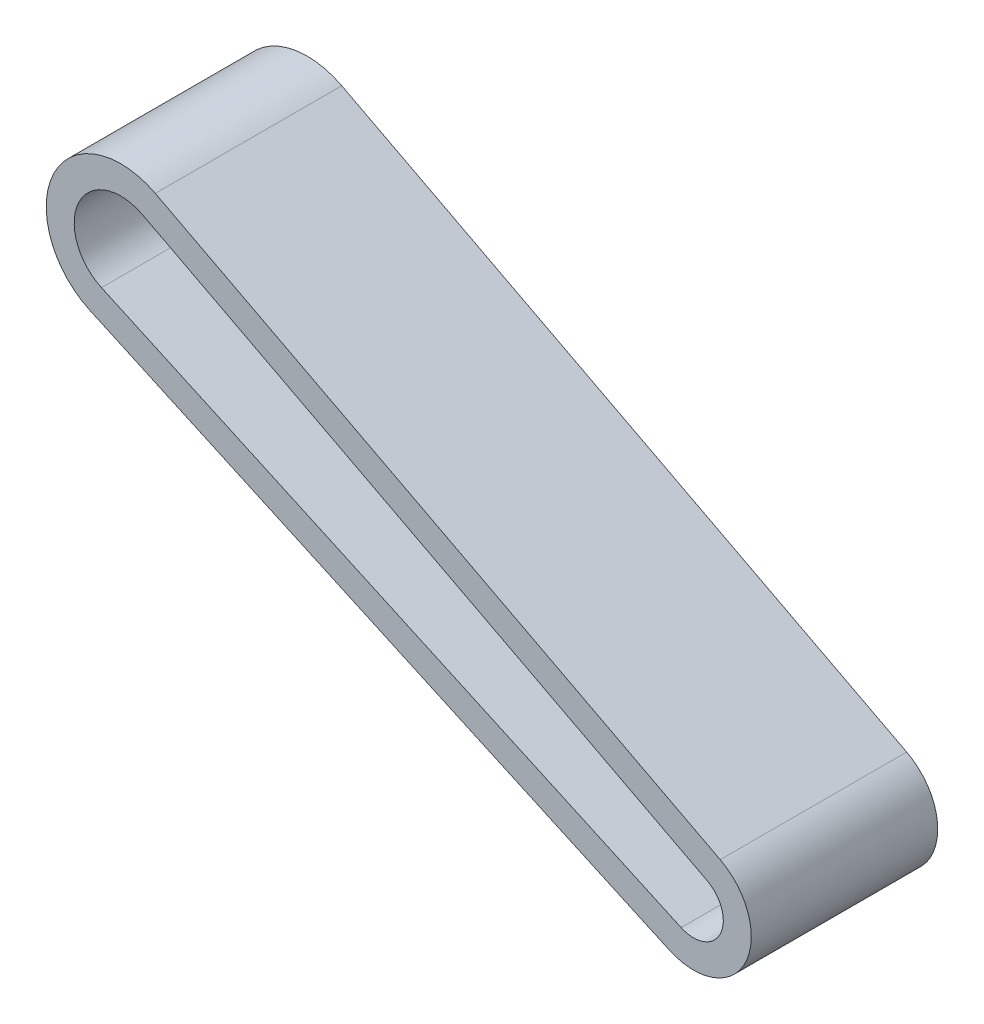
ISO-10303-21;
HEADER;
FILE_DESCRIPTION(('STEP AP214'),'2;1');
FILE_NAME('part.step','',(''),(''),'','','');
FILE_SCHEMA(('AUTOMOTIVE_DESIGN { 1 0 10303 214 1 1 1 1 }'));
ENDSEC;
DATA;
#1=APPLICATION_CONTEXT('core data for automotive mechanical design processes');
#2=APPLICATION_PROTOCOL_DEFINITION('international standard','automotive_design',2000,#1);
#3=PRODUCT_CONTEXT('',#1,'mechanical');
#4=PRODUCT('Part','Part','',(#3));
#5=PRODUCT_RELATED_PRODUCT_CATEGORY('part','',(#4));
#6=PRODUCT_DEFINITION_FORMATION('','',#4);
#7=PRODUCT_DEFINITION_CONTEXT('part definition',#1,'design');
#8=PRODUCT_DEFINITION('design','',#6,#7);
#9=PRODUCT_DEFINITION_SHAPE('','',#8);
#10=(LENGTH_UNIT() NAMED_UNIT(*) SI_UNIT(.MILLI.,.METRE.));
#11=(NAMED_UNIT(*) PLANE_ANGLE_UNIT() SI_UNIT($,.RADIAN.));
#12=(NAMED_UNIT(*) SI_UNIT($,.STERADIAN.) SOLID_ANGLE_UNIT());
#13=UNCERTAINTY_MEASURE_WITH_UNIT(LENGTH_MEASURE(1.E-05),#10,'distance_accuracy_value','');
#14=(GEOMETRIC_REPRESENTATION_CONTEXT(3) GLOBAL_UNCERTAINTY_ASSIGNED_CONTEXT((#13)) GLOBAL_UNIT_ASSIGNED_CONTEXT((#10,
#11,#12)) REPRESENTATION_CONTEXT('',''));
#15=CARTESIAN_POINT('',(0.,0.,0.));
#16=DIRECTION('',(0.,0.,1.));
#17=DIRECTION('',(1.,0.,0.));
#18=AXIS2_PLACEMENT_3D('',#15,#16,#17);
#19=CARTESIAN_POINT('',(383.646560531932,7.49999999999694,5.));
#20=DIRECTION('',(0.,0.,1.));
#21=DIRECTION('',(1.,0.,0.));
#22=AXIS2_PLACEMENT_3D('',#19,#20,#21);
#23=PLANE('',#22);
#24=CARTESIAN_POINT('',(383.646560531932,7.49999999999694,5.));
#25=DIRECTION('',(0.,0.,1.));
#26=DIRECTION('',(1.,0.,0.));
#27=AXIS2_PLACEMENT_3D('',#24,#25,#26);
#28=CIRCLE('',#27,3.10000000000006);
#29=CARTESIAN_POINT('',(382.360077523528,4.67954587537645,5.));
#30=VERTEX_POINT('',#29);
#31=CARTESIAN_POINT('',(385.079723977688,10.2488256652127,5.));
#32=VERTEX_POINT('',#31);
#33=EDGE_CURVE('E162',#30,#32,#28,.T.);
#34=ORIENTED_EDGE('',*,*,#33,.T.);
#35=DIRECTION('',(-0.886717956521201,0.462310788953562,0.));
#36=VECTOR('',#35,1.);
#37=CARTESIAN_POINT('',(385.079723977688,10.2488256652127,5.));
#38=LINE('',#37,#36);
#39=CARTESIAN_POINT('',(354.778871080645,26.0468718260864,5.));
#40=VERTEX_POINT('',#39);
#41=EDGE_CURVE('E165',#32,#40,#38,.T.);
#42=ORIENTED_EDGE('',*,*,#41,.T.);
#43=CARTESIAN_POINT('',(352.929627924831,22.5000000000016,5.));
#44=DIRECTION('',(0.,0.,1.));
#45=DIRECTION('',(1.,0.,0.));
#46=AXIS2_PLACEMENT_3D('',#43,#44,#45);
#47=CIRCLE('',#46,4.);
#48=CARTESIAN_POINT('',(351.269649849471,18.8607043553301,5.));
#49=VERTEX_POINT('',#48);
#50=EDGE_CURVE('E168',#40,#49,#47,.T.);
#51=ORIENTED_EDGE('',*,*,#50,.T.);
#52=DIRECTION('',(0.909823911167876,-0.414994518839935,0.));
#53=VECTOR('',#52,1.);
#54=CARTESIAN_POINT('',(351.269649849471,18.8607043553301,5.));
#55=LINE('',#54,#53);
#56=EDGE_CURVE('E170',#49,#30,#55,.T.);
#57=ORIENTED_EDGE('',*,*,#56,.T.);
#58=EDGE_LOOP('',(#34,#42,#51,#57));
#59=FACE_BOUND('',#58,.T.);
#60=DIRECTION('',(-0.886717956521201,0.462310788953562,0.));
#61=VECTOR('',#60,1.);
#62=CARTESIAN_POINT('',(384.386257794257,8.91874873043091,5.));
#63=LINE('',#62,#61);
#64=CARTESIAN_POINT('',(384.386257794257,8.91874873043091,5.));
#65=VERTEX_POINT('',#64);
#66=CARTESIAN_POINT('',(354.085404897215,24.7167948913046,5.));
#67=VERTEX_POINT('',#66);
#68=EDGE_CURVE('E134',#65,#67,#63,.T.);
#69=ORIENTED_EDGE('',*,*,#68,.F.);
#70=CARTESIAN_POINT('',(383.646560531932,7.49999999999694,5.));
#71=DIRECTION('',(0.,0.,1.));
#72=DIRECTION('',(1.,0.,0.));
#73=AXIS2_PLACEMENT_3D('',#70,#71,#72);
#74=CIRCLE('',#73,1.60000000000006);
#75=CARTESIAN_POINT('',(382.982569301788,6.04428174212827,5.));
#76=VERTEX_POINT('',#75);
#77=EDGE_CURVE('E126',#76,#65,#74,.T.);
#78=ORIENTED_EDGE('',*,*,#77,.F.);
#79=DIRECTION('',(0.909823911167876,-0.414994518839935,0.));
#80=VECTOR('',#79,1.);
#81=CARTESIAN_POINT('',(351.892141627731,20.2254402220819,5.));
#82=LINE('',#81,#80);
#83=CARTESIAN_POINT('',(351.892141627731,20.2254402220819,5.));
#84=VERTEX_POINT('',#83);
#85=EDGE_CURVE('E148',#84,#76,#82,.T.);
#86=ORIENTED_EDGE('',*,*,#85,.F.);
#87=CARTESIAN_POINT('',(352.929627924831,22.5000000000016,5.));
#88=DIRECTION('',(0.,0.,1.));
#89=DIRECTION('',(1.,0.,0.));
#90=AXIS2_PLACEMENT_3D('',#87,#88,#89);
#91=CIRCLE('',#90,2.5);
#92=EDGE_CURVE('E146',#67,#84,#91,.T.);
#93=ORIENTED_EDGE('',*,*,#92,.F.);
#94=EDGE_LOOP('',(#69,#78,#86,#93));
#95=FACE_BOUND('',#94,.T.);
#96=ADVANCED_FACE('F61',(#59,#95),#23,.T.);
#97=CARTESIAN_POINT('',(383.646560531932,7.49999999999694,-5.));
#98=DIRECTION('',(0.,0.,1.));
#99=DIRECTION('',(1.,0.,0.));
#100=AXIS2_PLACEMENT_3D('',#97,#98,#99);
#101=PLANE('',#100);
#102=CARTESIAN_POINT('',(383.646560531932,7.49999999999694,-5.));
#103=DIRECTION('',(0.,0.,1.));
#104=DIRECTION('',(1.,0.,0.));
#105=AXIS2_PLACEMENT_3D('',#102,#103,#104);
#106=CIRCLE('',#105,3.10000000000006);
#107=CARTESIAN_POINT('',(382.360077523528,4.67954587537645,-5.));
#108=VERTEX_POINT('',#107);
#109=CARTESIAN_POINT('',(385.079723977688,10.2488256652127,-5.));
#110=VERTEX_POINT('',#109);
#111=EDGE_CURVE('E142',#108,#110,#106,.T.);
#112=ORIENTED_EDGE('',*,*,#111,.F.);
#113=DIRECTION('',(0.909823911167876,-0.414994518839935,0.));
#114=VECTOR('',#113,1.);
#115=CARTESIAN_POINT('',(351.269649849471,18.8607043553301,-5.));
#116=LINE('',#115,#114);
#117=CARTESIAN_POINT('',(351.269649849471,18.8607043553301,-5.));
#118=VERTEX_POINT('',#117);
#119=EDGE_CURVE('E166',#118,#108,#116,.T.);
#120=ORIENTED_EDGE('',*,*,#119,.F.);
#121=CARTESIAN_POINT('',(352.929627924831,22.5000000000016,-5.));
#122=DIRECTION('',(0.,0.,1.));
#123=DIRECTION('',(1.,0.,0.));
#124=AXIS2_PLACEMENT_3D('',#121,#122,#123);
#125=CIRCLE('',#124,4.);
#126=CARTESIAN_POINT('',(354.778871080645,26.0468718260864,-5.));
#127=VERTEX_POINT('',#126);
#128=EDGE_CURVE('E177',#127,#118,#125,.T.);
#129=ORIENTED_EDGE('',*,*,#128,.F.);
#130=DIRECTION('',(-0.886717956521201,0.462310788953562,0.));
#131=VECTOR('',#130,1.);
#132=CARTESIAN_POINT('',(385.079723977688,10.2488256652127,-5.));
#133=LINE('',#132,#131);
#134=EDGE_CURVE('E175',#110,#127,#133,.T.);
#135=ORIENTED_EDGE('',*,*,#134,.F.);
#136=EDGE_LOOP('',(#112,#120,#129,#135));
#137=FACE_BOUND('',#136,.T.);
#138=CARTESIAN_POINT('',(383.646560531932,7.49999999999694,-5.));
#139=DIRECTION('',(0.,0.,1.));
#140=DIRECTION('',(1.,0.,0.));
#141=AXIS2_PLACEMENT_3D('',#138,#139,#140);
#142=CIRCLE('',#141,1.60000000000006);
#143=CARTESIAN_POINT('',(382.982569301788,6.04428174212828,-5.));
#144=VERTEX_POINT('',#143);
#145=CARTESIAN_POINT('',(384.386257794257,8.91874873043091,-5.));
#146=VERTEX_POINT('',#145);
#147=EDGE_CURVE('E84',#144,#146,#142,.T.);
#148=ORIENTED_EDGE('',*,*,#147,.T.);
#149=DIRECTION('',(-0.886717956521201,0.462310788953562,0.));
#150=VECTOR('',#149,1.);
#151=CARTESIAN_POINT('',(384.386257794257,8.91874873043091,-5.));
#152=LINE('',#151,#150);
#153=CARTESIAN_POINT('',(354.085404897215,24.7167948913046,-5.));
#154=VERTEX_POINT('',#153);
#155=EDGE_CURVE('E141',#146,#154,#152,.T.);
#156=ORIENTED_EDGE('',*,*,#155,.T.);
#157=CARTESIAN_POINT('',(352.929627924831,22.5000000000016,-5.));
#158=DIRECTION('',(0.,0.,1.));
#159=DIRECTION('',(1.,0.,0.));
#160=AXIS2_PLACEMENT_3D('',#157,#158,#159);
#161=CIRCLE('',#160,2.5);
#162=CARTESIAN_POINT('',(351.892141627731,20.2254402220819,-5.));
#163=VERTEX_POINT('',#162);
#164=EDGE_CURVE('E154',#154,#163,#161,.T.);
#165=ORIENTED_EDGE('',*,*,#164,.T.);
#166=DIRECTION('',(0.909823911167876,-0.414994518839935,0.));
#167=VECTOR('',#166,1.);
#168=CARTESIAN_POINT('',(351.892141627731,20.2254402220819,-5.));
#169=LINE('',#168,#167);
#170=EDGE_CURVE('E135',#163,#144,#169,.T.);
#171=ORIENTED_EDGE('',*,*,#170,.T.);
#172=EDGE_LOOP('',(#148,#156,#165,#171));
#173=FACE_BOUND('',#172,.T.);
#174=ADVANCED_FACE('F195',(#137,#173),#101,.F.);
#175=CARTESIAN_POINT('',(383.646560531932,7.49999999999694,5.));
#176=DIRECTION('',(0.,0.,-1.));
#177=DIRECTION('',(-1.,0.,0.));
#178=AXIS2_PLACEMENT_3D('',#175,#176,#177);
#179=CYLINDRICAL_SURFACE('',#178,3.10000000000006);
#180=ORIENTED_EDGE('',*,*,#111,.T.);
#181=DIRECTION('',(0.,0.,-1.));
#182=VECTOR('',#181,1.);
#183=CARTESIAN_POINT('',(385.079723977688,10.2488256652127,5.));
#184=LINE('',#183,#182);
#185=EDGE_CURVE('E12',#32,#110,#184,.T.);
#186=ORIENTED_EDGE('',*,*,#185,.F.);
#187=ORIENTED_EDGE('',*,*,#33,.F.);
#188=DIRECTION('',(0.,0.,-1.));
#189=VECTOR('',#188,1.);
#190=CARTESIAN_POINT('',(382.360077523528,4.67954587537645,5.));
#191=LINE('',#190,#189);
#192=EDGE_CURVE('E172',#30,#108,#191,.T.);
#193=ORIENTED_EDGE('',*,*,#192,.T.);
#194=EDGE_LOOP('',(#180,#186,#187,#193));
#195=FACE_BOUND('',#194,.T.);
#196=ADVANCED_FACE('F63',(#195),#179,.T.);
#197=CARTESIAN_POINT('',(385.079723977688,10.2488256652127,5.));
#198=DIRECTION('',(-0.462310788953562,-0.886717956521201,0.));
#199=DIRECTION('',(0.886717956521201,-0.462310788953562,0.));
#200=AXIS2_PLACEMENT_3D('',#197,#198,#199);
#201=PLANE('',#200);
#202=ORIENTED_EDGE('',*,*,#134,.T.);
#203=DIRECTION('',(0.,0.,-1.));
#204=VECTOR('',#203,1.);
#205=CARTESIAN_POINT('',(354.778871080645,26.0468718260864,5.));
#206=LINE('',#205,#204);
#207=EDGE_CURVE('E69',#40,#127,#206,.T.);
#208=ORIENTED_EDGE('',*,*,#207,.F.);
#209=ORIENTED_EDGE('',*,*,#41,.F.);
#210=ORIENTED_EDGE('',*,*,#185,.T.);
#211=EDGE_LOOP('',(#202,#208,#209,#210));
#212=FACE_BOUND('',#211,.T.);
#213=ADVANCED_FACE('F205',(#212),#201,.F.);
#214=CARTESIAN_POINT('',(352.929627924831,22.5000000000016,5.));
#215=DIRECTION('',(0.,0.,-1.));
#216=DIRECTION('',(-1.,0.,0.));
#217=AXIS2_PLACEMENT_3D('',#214,#215,#216);
#218=CYLINDRICAL_SURFACE('',#217,4.);
#219=ORIENTED_EDGE('',*,*,#128,.T.);
#220=DIRECTION('',(0.,0.,-1.));
#221=VECTOR('',#220,1.);
#222=CARTESIAN_POINT('',(351.269649849471,18.8607043553301,5.));
#223=LINE('',#222,#221);
#224=EDGE_CURVE('E182',#49,#118,#223,.T.);
#225=ORIENTED_EDGE('',*,*,#224,.F.);
#226=ORIENTED_EDGE('',*,*,#50,.F.);
#227=ORIENTED_EDGE('',*,*,#207,.T.);
#228=EDGE_LOOP('',(#219,#225,#226,#227));
#229=FACE_BOUND('',#228,.T.);
#230=ADVANCED_FACE('F189',(#229),#218,.T.);
#231=CARTESIAN_POINT('',(351.269649849471,18.8607043553301,5.));
#232=DIRECTION('',(0.414994518839935,0.909823911167876,0.));
#233=DIRECTION('',(-0.909823911167876,0.414994518839935,0.));
#234=AXIS2_PLACEMENT_3D('',#231,#232,#233);
#235=PLANE('',#234);
#236=ORIENTED_EDGE('',*,*,#119,.T.);
#237=ORIENTED_EDGE('',*,*,#192,.F.);
#238=ORIENTED_EDGE('',*,*,#56,.F.);
#239=ORIENTED_EDGE('',*,*,#224,.T.);
#240=EDGE_LOOP('',(#236,#237,#238,#239));
#241=FACE_BOUND('',#240,.T.);
#242=ADVANCED_FACE('F199',(#241),#235,.F.);
#243=CARTESIAN_POINT('',(383.646560531932,7.49999999999694,5.));
#244=DIRECTION('',(0.,0.,-1.));
#245=DIRECTION('',(-1.,0.,0.));
#246=AXIS2_PLACEMENT_3D('',#243,#244,#245);
#247=CYLINDRICAL_SURFACE('',#246,1.60000000000006);
#248=ORIENTED_EDGE('',*,*,#147,.F.);
#249=DIRECTION('',(0.,0.,-1.));
#250=VECTOR('',#249,1.);
#251=CARTESIAN_POINT('',(382.982569301788,6.04428174212827,5.));
#252=LINE('',#251,#250);
#253=EDGE_CURVE('E130',#76,#144,#252,.T.);
#254=ORIENTED_EDGE('',*,*,#253,.F.);
#255=ORIENTED_EDGE('',*,*,#77,.T.);
#256=DIRECTION('',(0.,0.,-1.));
#257=VECTOR('',#256,1.);
#258=CARTESIAN_POINT('',(384.386257794257,8.91874873043091,5.));
#259=LINE('',#258,#257);
#260=EDGE_CURVE('E129',#65,#146,#259,.T.);
#261=ORIENTED_EDGE('',*,*,#260,.T.);
#262=EDGE_LOOP('',(#248,#254,#255,#261));
#263=FACE_BOUND('',#262,.T.);
#264=ADVANCED_FACE('F128',(#263),#247,.F.);
#265=CARTESIAN_POINT('',(384.386257794257,8.91874873043091,5.));
#266=DIRECTION('',(-0.462310788953562,-0.886717956521201,0.));
#267=DIRECTION('',(0.886717956521201,-0.462310788953562,0.));
#268=AXIS2_PLACEMENT_3D('',#265,#266,#267);
#269=PLANE('',#268);
#270=ORIENTED_EDGE('',*,*,#155,.F.);
#271=ORIENTED_EDGE('',*,*,#260,.F.);
#272=ORIENTED_EDGE('',*,*,#68,.T.);
#273=DIRECTION('',(0.,0.,-1.));
#274=VECTOR('',#273,1.);
#275=CARTESIAN_POINT('',(354.085404897215,24.7167948913046,5.));
#276=LINE('',#275,#274);
#277=EDGE_CURVE('E143',#67,#154,#276,.T.);
#278=ORIENTED_EDGE('',*,*,#277,.T.);
#279=EDGE_LOOP('',(#270,#271,#272,#278));
#280=FACE_BOUND('',#279,.T.);
#281=ADVANCED_FACE('F138',(#280),#269,.T.);
#282=CARTESIAN_POINT('',(352.929627924831,22.5000000000016,5.));
#283=DIRECTION('',(0.,0.,-1.));
#284=DIRECTION('',(-1.,0.,0.));
#285=AXIS2_PLACEMENT_3D('',#282,#283,#284);
#286=CYLINDRICAL_SURFACE('',#285,2.5);
#287=ORIENTED_EDGE('',*,*,#164,.F.);
#288=ORIENTED_EDGE('',*,*,#277,.F.);
#289=ORIENTED_EDGE('',*,*,#92,.T.);
#290=DIRECTION('',(0.,0.,-1.));
#291=VECTOR('',#290,1.);
#292=CARTESIAN_POINT('',(351.892141627731,20.2254402220819,5.));
#293=LINE('',#292,#291);
#294=EDGE_CURVE('E76',#84,#163,#293,.T.);
#295=ORIENTED_EDGE('',*,*,#294,.T.);
#296=EDGE_LOOP('',(#287,#288,#289,#295));
#297=FACE_BOUND('',#296,.T.);
#298=ADVANCED_FACE('F228',(#297),#286,.F.);
#299=CARTESIAN_POINT('',(351.892141627731,20.2254402220819,5.));
#300=DIRECTION('',(0.414994518839935,0.909823911167876,0.));
#301=DIRECTION('',(-0.909823911167876,0.414994518839935,0.));
#302=AXIS2_PLACEMENT_3D('',#299,#300,#301);
#303=PLANE('',#302);
#304=ORIENTED_EDGE('',*,*,#170,.F.);
#305=ORIENTED_EDGE('',*,*,#294,.F.);
#306=ORIENTED_EDGE('',*,*,#85,.T.);
#307=ORIENTED_EDGE('',*,*,#253,.T.);
#308=EDGE_LOOP('',(#304,#305,#306,#307));
#309=FACE_BOUND('',#308,.T.);
#310=ADVANCED_FACE('F232',(#309),#303,.T.);
#311=CLOSED_SHELL('',(#96,#174,#196,#213,#230,#242,#264,#281,#298,#310));
#312=MANIFOLD_SOLID_BREP('B2',#311);
#313=ADVANCED_BREP_SHAPE_REPRESENTATION('',(#18,#312),#14);
#314=SHAPE_DEFINITION_REPRESENTATION(#9,#313);
ENDSEC;
END-ISO-10303-21;
